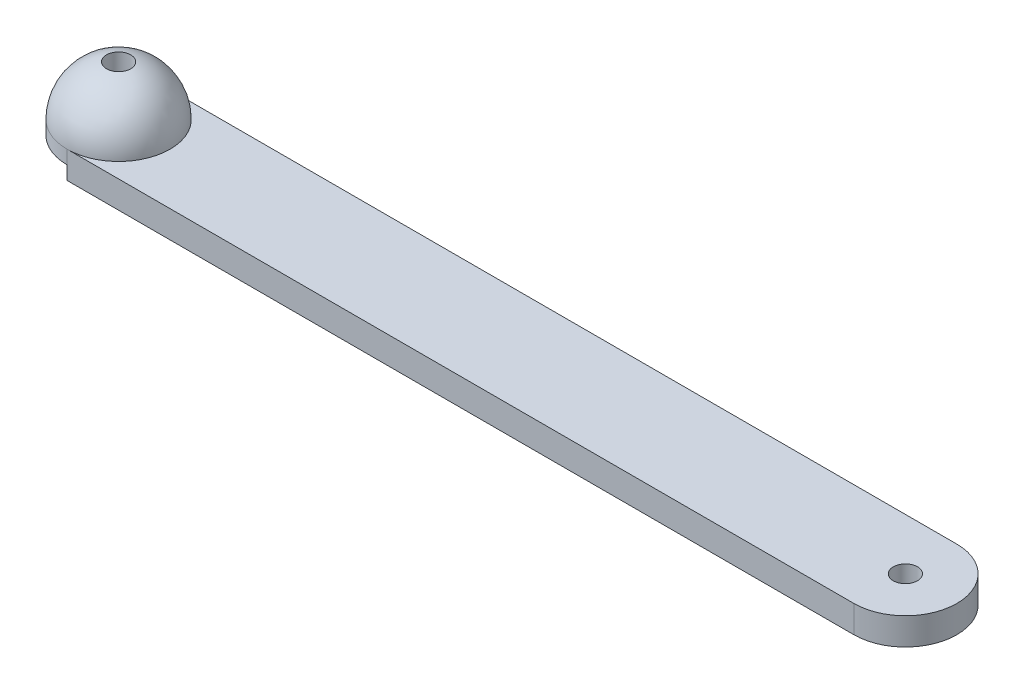
ISO-10303-21;
HEADER;
FILE_DESCRIPTION(('STEP AP214'),'2;1');
FILE_NAME('part.step','',(''),(''),'','','');
FILE_SCHEMA(('AUTOMOTIVE_DESIGN { 1 0 10303 214 1 1 1 1 }'));
ENDSEC;
DATA;
#1=APPLICATION_CONTEXT('core data for automotive mechanical design processes');
#2=APPLICATION_PROTOCOL_DEFINITION('international standard','automotive_design',2000,#1);
#3=PRODUCT_CONTEXT('',#1,'mechanical');
#4=PRODUCT('Part','Part','',(#3));
#5=PRODUCT_RELATED_PRODUCT_CATEGORY('part','',(#4));
#6=PRODUCT_DEFINITION_FORMATION('','',#4);
#7=PRODUCT_DEFINITION_CONTEXT('part definition',#1,'design');
#8=PRODUCT_DEFINITION('design','',#6,#7);
#9=PRODUCT_DEFINITION_SHAPE('','',#8);
#10=(LENGTH_UNIT() NAMED_UNIT(*) SI_UNIT(.MILLI.,.METRE.));
#11=(NAMED_UNIT(*) PLANE_ANGLE_UNIT() SI_UNIT($,.RADIAN.));
#12=(NAMED_UNIT(*) SI_UNIT($,.STERADIAN.) SOLID_ANGLE_UNIT());
#13=UNCERTAINTY_MEASURE_WITH_UNIT(LENGTH_MEASURE(1.E-05),#10,'distance_accuracy_value','');
#14=(GEOMETRIC_REPRESENTATION_CONTEXT(3) GLOBAL_UNCERTAINTY_ASSIGNED_CONTEXT((#13)) GLOBAL_UNIT_ASSIGNED_CONTEXT((#10,
#11,#12)) REPRESENTATION_CONTEXT('',''));
#15=CARTESIAN_POINT('',(0.,0.,0.));
#16=DIRECTION('',(0.,0.,1.));
#17=DIRECTION('',(1.,0.,0.));
#18=AXIS2_PLACEMENT_3D('',#15,#16,#17);
#19=CARTESIAN_POINT('',(-232.15,8.,0.));
#20=DIRECTION('',(0.,-1.,0.));
#21=DIRECTION('',(0.,0.,-1.));
#22=AXIS2_PLACEMENT_3D('',#19,#20,#21);
#23=CYLINDRICAL_SURFACE('',#22,30.35);
#24=DIRECTION('',(0.,-1.,0.));
#25=VECTOR('',#24,1.);
#26=CARTESIAN_POINT('',(-232.15,8.,-30.35));
#27=LINE('',#26,#25);
#28=CARTESIAN_POINT('',(-232.15,8.,-30.35));
#29=VERTEX_POINT('',#28);
#30=CARTESIAN_POINT('',(-232.15,0.,-30.35));
#31=VERTEX_POINT('',#30);
#32=EDGE_CURVE('E134',#29,#31,#27,.T.);
#33=ORIENTED_EDGE('',*,*,#32,.T.);
#34=CARTESIAN_POINT('',(-232.15,0.,0.));
#35=DIRECTION('',(0.,1.,0.));
#36=DIRECTION('',(0.,0.,1.));
#37=AXIS2_PLACEMENT_3D('',#34,#35,#36);
#38=CIRCLE('',#37,30.35);
#39=CARTESIAN_POINT('',(-232.15,0.,30.35));
#40=VERTEX_POINT('',#39);
#41=EDGE_CURVE('E105',#31,#40,#38,.T.);
#42=ORIENTED_EDGE('',*,*,#41,.T.);
#43=DIRECTION('',(0.,-1.,0.));
#44=VECTOR('',#43,1.);
#45=CARTESIAN_POINT('',(-232.15,8.,30.35));
#46=LINE('',#45,#44);
#47=CARTESIAN_POINT('',(-232.15,8.,30.35));
#48=VERTEX_POINT('',#47);
#49=EDGE_CURVE('E11',#48,#40,#46,.T.);
#50=ORIENTED_EDGE('',*,*,#49,.F.);
#51=CARTESIAN_POINT('',(-232.15,8.,0.));
#52=DIRECTION('',(0.,1.,0.));
#53=DIRECTION('',(0.,0.,1.));
#54=AXIS2_PLACEMENT_3D('',#51,#52,#53);
#55=CIRCLE('',#54,30.35);
#56=EDGE_CURVE('E84',#29,#48,#55,.T.);
#57=ORIENTED_EDGE('',*,*,#56,.F.);
#58=EDGE_LOOP('',(#33,#42,#50,#57));
#59=FACE_BOUND('',#58,.T.);
#60=ADVANCED_FACE('F38',(#59),#23,.T.);
#61=CARTESIAN_POINT('',(-232.15,8.,30.35));
#62=DIRECTION('',(0.,0.,-1.));
#63=DIRECTION('',(-1.,0.,0.));
#64=AXIS2_PLACEMENT_3D('',#61,#62,#63);
#65=PLANE('',#64);
#66=DIRECTION('',(1.,0.,0.));
#67=VECTOR('',#66,1.);
#68=CARTESIAN_POINT('',(-232.15,-8.,30.35));
#69=LINE('',#68,#67);
#70=CARTESIAN_POINT('',(-232.15,-8.,30.35));
#71=VERTEX_POINT('',#70);
#72=CARTESIAN_POINT('',(232.15,-8.,30.35));
#73=VERTEX_POINT('',#72);
#74=EDGE_CURVE('E110',#71,#73,#69,.T.);
#75=ORIENTED_EDGE('',*,*,#74,.T.);
#76=DIRECTION('',(0.,-1.,0.));
#77=VECTOR('',#76,1.);
#78=CARTESIAN_POINT('',(232.15,8.,30.35));
#79=LINE('',#78,#77);
#80=CARTESIAN_POINT('',(232.15,8.,30.35));
#81=VERTEX_POINT('',#80);
#82=EDGE_CURVE('E48',#81,#73,#79,.T.);
#83=ORIENTED_EDGE('',*,*,#82,.F.);
#84=DIRECTION('',(1.,0.,0.));
#85=VECTOR('',#84,1.);
#86=CARTESIAN_POINT('',(-232.15,8.,30.35));
#87=LINE('',#86,#85);
#88=EDGE_CURVE('E156',#48,#81,#87,.T.);
#89=ORIENTED_EDGE('',*,*,#88,.F.);
#90=ORIENTED_EDGE('',*,*,#49,.T.);
#91=DIRECTION('',(0.,-1.,0.));
#92=VECTOR('',#91,1.);
#93=CARTESIAN_POINT('',(-232.15,0.,30.35));
#94=LINE('',#93,#92);
#95=EDGE_CURVE('E98',#71,#40,#94,.F.);
#96=ORIENTED_EDGE('',*,*,#95,.F.);
#97=EDGE_LOOP('',(#75,#83,#89,#90,#96));
#98=FACE_BOUND('',#97,.T.);
#99=ADVANCED_FACE('F108',(#98),#65,.F.);
#100=CARTESIAN_POINT('',(232.15,8.,0.));
#101=DIRECTION('',(0.,-1.,0.));
#102=DIRECTION('',(0.,0.,-1.));
#103=AXIS2_PLACEMENT_3D('',#100,#101,#102);
#104=CYLINDRICAL_SURFACE('',#103,30.35);
#105=CARTESIAN_POINT('',(232.15,-8.,0.));
#106=DIRECTION('',(0.,1.,0.));
#107=DIRECTION('',(0.,0.,1.));
#108=AXIS2_PLACEMENT_3D('',#105,#106,#107);
#109=CIRCLE('',#108,30.35);
#110=CARTESIAN_POINT('',(232.15,-8.,-30.35));
#111=VERTEX_POINT('',#110);
#112=EDGE_CURVE('E71',#73,#111,#109,.T.);
#113=ORIENTED_EDGE('',*,*,#112,.T.);
#114=DIRECTION('',(0.,-1.,0.));
#115=VECTOR('',#114,1.);
#116=CARTESIAN_POINT('',(232.15,8.,-30.35));
#117=LINE('',#116,#115);
#118=CARTESIAN_POINT('',(232.15,8.,-30.35));
#119=VERTEX_POINT('',#118);
#120=EDGE_CURVE('E138',#119,#111,#117,.T.);
#121=ORIENTED_EDGE('',*,*,#120,.F.);
#122=CARTESIAN_POINT('',(232.15,8.,0.));
#123=DIRECTION('',(0.,1.,0.));
#124=DIRECTION('',(0.,0.,1.));
#125=AXIS2_PLACEMENT_3D('',#122,#123,#124);
#126=CIRCLE('',#125,30.35);
#127=EDGE_CURVE('E57',#81,#119,#126,.T.);
#128=ORIENTED_EDGE('',*,*,#127,.F.);
#129=ORIENTED_EDGE('',*,*,#82,.T.);
#130=EDGE_LOOP('',(#113,#121,#128,#129));
#131=FACE_BOUND('',#130,.T.);
#132=ADVANCED_FACE('F192',(#131),#104,.T.);
#133=CARTESIAN_POINT('',(-232.15,8.,-30.35));
#134=DIRECTION('',(0.,0.,1.));
#135=DIRECTION('',(1.,0.,0.));
#136=AXIS2_PLACEMENT_3D('',#133,#134,#135);
#137=PLANE('',#136);
#138=DIRECTION('',(-1.,0.,0.));
#139=VECTOR('',#138,1.);
#140=CARTESIAN_POINT('',(-232.15,-8.,-30.35));
#141=LINE('',#140,#139);
#142=CARTESIAN_POINT('',(-232.15,-8.,-30.35));
#143=VERTEX_POINT('',#142);
#144=EDGE_CURVE('E123',#111,#143,#141,.T.);
#145=ORIENTED_EDGE('',*,*,#144,.T.);
#146=DIRECTION('',(0.,-1.,0.));
#147=VECTOR('',#146,1.);
#148=CARTESIAN_POINT('',(-232.15,0.,-30.35));
#149=LINE('',#148,#147);
#150=EDGE_CURVE('E78',#143,#31,#149,.F.);
#151=ORIENTED_EDGE('',*,*,#150,.T.);
#152=ORIENTED_EDGE('',*,*,#32,.F.);
#153=DIRECTION('',(-1.,0.,0.));
#154=VECTOR('',#153,1.);
#155=CARTESIAN_POINT('',(-232.15,8.,-30.35));
#156=LINE('',#155,#154);
#157=EDGE_CURVE('E129',#119,#29,#156,.T.);
#158=ORIENTED_EDGE('',*,*,#157,.F.);
#159=ORIENTED_EDGE('',*,*,#120,.T.);
#160=EDGE_LOOP('',(#145,#151,#152,#158,#159));
#161=FACE_BOUND('',#160,.T.);
#162=ADVANCED_FACE('F164',(#161),#137,.F.);
#163=CARTESIAN_POINT('',(-232.15,8.,0.));
#164=DIRECTION('',(0.,1.,0.));
#165=DIRECTION('',(0.,0.,1.));
#166=AXIS2_PLACEMENT_3D('',#163,#164,#165);
#167=PLANE('',#166);
#168=CARTESIAN_POINT('',(232.15,8.,0.));
#169=DIRECTION('',(0.,1.,0.));
#170=DIRECTION('',(0.,0.,1.));
#171=AXIS2_PLACEMENT_3D('',#168,#169,#170);
#172=CIRCLE('',#171,7.14999999999998);
#173=CARTESIAN_POINT('',(232.15,8.,7.14999999999998));
#174=VERTEX_POINT('',#173);
#175=EDGE_CURVE('E126',#174,#174,#172,.T.);
#176=ORIENTED_EDGE('',*,*,#175,.F.);
#177=EDGE_LOOP('',(#176));
#178=FACE_BOUND('',#177,.T.);
#179=ORIENTED_EDGE('',*,*,#157,.T.);
#180=CARTESIAN_POINT('',(-232.15,8.,0.));
#181=DIRECTION('',(0.,-1.,0.));
#182=DIRECTION('',(0.,0.,-1.));
#183=AXIS2_PLACEMENT_3D('',#180,#181,#182);
#184=CIRCLE('',#183,30.35);
#185=EDGE_CURVE('E144',#29,#48,#184,.T.);
#186=ORIENTED_EDGE('',*,*,#185,.T.);
#187=ORIENTED_EDGE('',*,*,#88,.T.);
#188=ORIENTED_EDGE('',*,*,#127,.T.);
#189=EDGE_LOOP('',(#179,#186,#187,#188));
#190=FACE_BOUND('',#189,.T.);
#191=ADVANCED_FACE('F162',(#178,#190),#167,.T.);
#192=CARTESIAN_POINT('',(-232.15,-8.,0.));
#193=DIRECTION('',(0.,1.,0.));
#194=DIRECTION('',(0.,0.,1.));
#195=AXIS2_PLACEMENT_3D('',#192,#193,#194);
#196=PLANE('',#195);
#197=CARTESIAN_POINT('',(-232.15,-8.,0.));
#198=DIRECTION('',(0.,1.,0.));
#199=DIRECTION('',(0.,0.,1.));
#200=AXIS2_PLACEMENT_3D('',#197,#198,#199);
#201=CIRCLE('',#200,30.35);
#202=EDGE_CURVE('E95',#71,#143,#201,.T.);
#203=ORIENTED_EDGE('',*,*,#202,.T.);
#204=ORIENTED_EDGE('',*,*,#144,.F.);
#205=ORIENTED_EDGE('',*,*,#112,.F.);
#206=ORIENTED_EDGE('',*,*,#74,.F.);
#207=EDGE_LOOP('',(#203,#204,#205,#206));
#208=FACE_BOUND('',#207,.T.);
#209=CARTESIAN_POINT('',(232.15,-8.,0.));
#210=DIRECTION('',(0.,1.,0.));
#211=DIRECTION('',(0.,0.,1.));
#212=AXIS2_PLACEMENT_3D('',#209,#210,#211);
#213=CIRCLE('',#212,7.14999999999998);
#214=CARTESIAN_POINT('',(232.15,-8.,7.14999999999998));
#215=VERTEX_POINT('',#214);
#216=EDGE_CURVE('E119',#215,#215,#213,.T.);
#217=ORIENTED_EDGE('',*,*,#216,.T.);
#218=EDGE_LOOP('',(#217));
#219=FACE_BOUND('',#218,.T.);
#220=ADVANCED_FACE('F116',(#208,#219),#196,.F.);
#221=CARTESIAN_POINT('',(232.15,-8.,0.));
#222=DIRECTION('',(0.,1.,0.));
#223=DIRECTION('',(0.,0.,1.));
#224=AXIS2_PLACEMENT_3D('',#221,#222,#223);
#225=CYLINDRICAL_SURFACE('',#224,7.14999999999998);
#226=ORIENTED_EDGE('',*,*,#216,.F.);
#227=EDGE_LOOP('',(#226));
#228=FACE_BOUND('',#227,.T.);
#229=ORIENTED_EDGE('',*,*,#175,.T.);
#230=EDGE_LOOP('',(#229));
#231=FACE_BOUND('',#230,.T.);
#232=ADVANCED_FACE('F202',(#228,#231),#225,.F.);
#233=CARTESIAN_POINT('',(-232.15,8.,0.));
#234=DIRECTION('',(0.,0.,1.));
#235=DIRECTION('',(1.,0.,0.));
#236=AXIS2_PLACEMENT_3D('',#233,#234,#235);
#237=SPHERICAL_SURFACE('',#236,30.35);
#238=CARTESIAN_POINT('',(-232.15,8.,0.));
#239=DIRECTION('',(0.,-1.,0.));
#240=DIRECTION('',(0.,0.,-1.));
#241=AXIS2_PLACEMENT_3D('',#238,#239,#240);
#242=SPHERICAL_SURFACE('',#241,30.35);
#243=CARTESIAN_POINT('',(-232.15,37.4957624075053,0.));
#244=DIRECTION('',(0.,-1.,0.));
#245=DIRECTION('',(0.,0.,-1.));
#246=AXIS2_PLACEMENT_3D('',#243,#244,#245);
#247=CIRCLE('',#246,7.14999999999998);
#248=CARTESIAN_POINT('',(-232.15,37.4957624075053,-7.14999999999998));
#249=VERTEX_POINT('',#248);
#250=EDGE_CURVE('E114',#249,#249,#247,.T.);
#251=ORIENTED_EDGE('',*,*,#250,.T.);
#252=EDGE_LOOP('',(#251));
#253=FACE_BOUND('',#252,.T.);
#254=ORIENTED_EDGE('',*,*,#185,.F.);
#255=ORIENTED_EDGE('',*,*,#56,.T.);
#256=EDGE_LOOP('',(#254,#255));
#257=FACE_BOUND('',#256,.T.);
#258=ADVANCED_FACE('F208',(#253,#257),#242,.T.);
#259=CARTESIAN_POINT('',(-232.15,38.35,0.));
#260=DIRECTION('',(0.,-1.,0.));
#261=DIRECTION('',(0.,0.,-1.));
#262=AXIS2_PLACEMENT_3D('',#259,#260,#261);
#263=CYLINDRICAL_SURFACE('',#262,7.14999999999998);
#264=CARTESIAN_POINT('',(-232.15,0.,0.));
#265=DIRECTION('',(0.,1.,0.));
#266=DIRECTION('',(0.,0.,1.));
#267=AXIS2_PLACEMENT_3D('',#264,#265,#266);
#268=CIRCLE('',#267,7.14999999999998);
#269=CARTESIAN_POINT('',(-232.15,0.,7.14999999999998));
#270=VERTEX_POINT('',#269);
#271=EDGE_CURVE('E41',#270,#270,#268,.F.);
#272=ORIENTED_EDGE('',*,*,#271,.T.);
#273=EDGE_LOOP('',(#272));
#274=FACE_BOUND('',#273,.T.);
#275=ORIENTED_EDGE('',*,*,#250,.F.);
#276=EDGE_LOOP('',(#275));
#277=FACE_BOUND('',#276,.T.);
#278=ADVANCED_FACE('F177',(#274,#277),#263,.F.);
#279=CARTESIAN_POINT('',(-232.15,0.,0.));
#280=DIRECTION('',(0.,-1.,0.));
#281=DIRECTION('',(0.,0.,-1.));
#282=AXIS2_PLACEMENT_3D('',#279,#280,#281);
#283=CYLINDRICAL_SURFACE('',#282,30.35);
#284=ORIENTED_EDGE('',*,*,#95,.T.);
#285=EDGE_CURVE('E169',#40,#31,#38,.T.);
#286=ORIENTED_EDGE('',*,*,#285,.T.);
#287=ORIENTED_EDGE('',*,*,#150,.F.);
#288=ORIENTED_EDGE('',*,*,#202,.F.);
#289=EDGE_LOOP('',(#284,#286,#287,#288));
#290=FACE_BOUND('',#289,.T.);
#291=ADVANCED_FACE('F97',(#290),#283,.F.);
#292=CARTESIAN_POINT('',(-232.15,0.,0.));
#293=DIRECTION('',(0.,1.,0.));
#294=DIRECTION('',(0.,0.,1.));
#295=AXIS2_PLACEMENT_3D('',#292,#293,#294);
#296=PLANE('',#295);
#297=ORIENTED_EDGE('',*,*,#285,.F.);
#298=ORIENTED_EDGE('',*,*,#41,.F.);
#299=EDGE_LOOP('',(#297,#298));
#300=FACE_BOUND('',#299,.T.);
#301=ORIENTED_EDGE('',*,*,#271,.F.);
#302=EDGE_LOOP('',(#301));
#303=FACE_BOUND('',#302,.T.);
#304=ADVANCED_FACE('F180',(#300,#303),#296,.F.);
#305=CLOSED_SHELL('',(#60,#99,#132,#162,#191,#220,#232,#258,#278,#291,#304));
#306=MANIFOLD_SOLID_BREP('B2',#305);
#307=ADVANCED_BREP_SHAPE_REPRESENTATION('',(#18,#306),#14);
#308=SHAPE_DEFINITION_REPRESENTATION(#9,#307);
ENDSEC;
END-ISO-10303-21;
